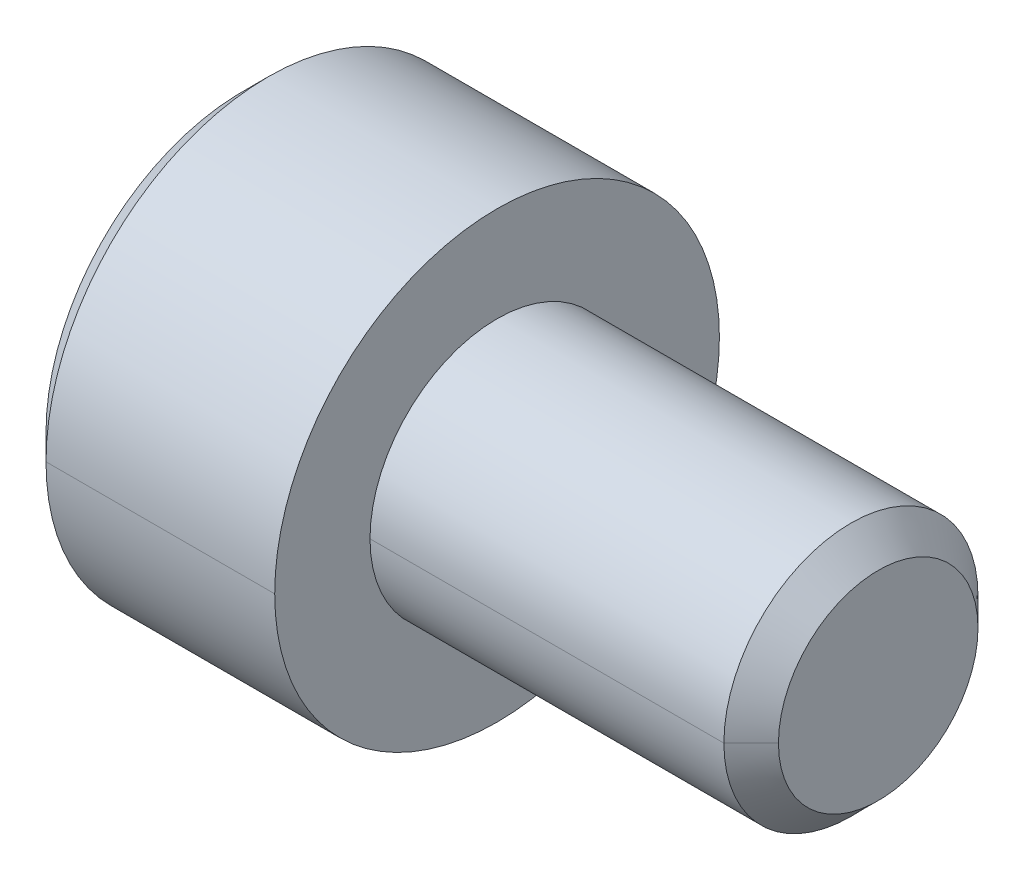
ISO-10303-21;
HEADER;
FILE_DESCRIPTION(('STEP AP214'),'2;1');
FILE_NAME('part.step','',(''),(''),'','','');
FILE_SCHEMA(('AUTOMOTIVE_DESIGN { 1 0 10303 214 1 1 1 1 }'));
ENDSEC;
DATA;
#1=APPLICATION_CONTEXT('core data for automotive mechanical design processes');
#2=APPLICATION_PROTOCOL_DEFINITION('international standard','automotive_design',2000,#1);
#3=PRODUCT_CONTEXT('',#1,'mechanical');
#4=PRODUCT('Part','Part','',(#3));
#5=PRODUCT_RELATED_PRODUCT_CATEGORY('part','',(#4));
#6=PRODUCT_DEFINITION_FORMATION('','',#4);
#7=PRODUCT_DEFINITION_CONTEXT('part definition',#1,'design');
#8=PRODUCT_DEFINITION('design','',#6,#7);
#9=PRODUCT_DEFINITION_SHAPE('','',#8);
#10=(LENGTH_UNIT() NAMED_UNIT(*) SI_UNIT(.MILLI.,.METRE.));
#11=(NAMED_UNIT(*) PLANE_ANGLE_UNIT() SI_UNIT($,.RADIAN.));
#12=(NAMED_UNIT(*) SI_UNIT($,.STERADIAN.) SOLID_ANGLE_UNIT());
#13=UNCERTAINTY_MEASURE_WITH_UNIT(LENGTH_MEASURE(1.E-05),#10,'distance_accuracy_value','');
#14=(GEOMETRIC_REPRESENTATION_CONTEXT(3) GLOBAL_UNCERTAINTY_ASSIGNED_CONTEXT((#13)) GLOBAL_UNIT_ASSIGNED_CONTEXT((#10,
#11,#12)) REPRESENTATION_CONTEXT('',''));
#15=CARTESIAN_POINT('',(0.,0.,0.));
#16=DIRECTION('',(0.,0.,1.));
#17=DIRECTION('',(1.,0.,0.));
#18=AXIS2_PLACEMENT_3D('',#15,#16,#17);
#19=CARTESIAN_POINT('',(-4.,0.,0.));
#20=DIRECTION('',(1.,0.,0.));
#21=DIRECTION('',(0.,-1.,0.));
#22=AXIS2_PLACEMENT_3D('',#19,#20,#21);
#23=CONICAL_SURFACE('',#22,3.1,0.7853981634);
#24=CARTESIAN_POINT('',(-3.6,0.,0.));
#25=DIRECTION('',(1.,0.,0.));
#26=DIRECTION('',(0.,0.,-1.));
#27=AXIS2_PLACEMENT_3D('',#24,#25,#26);
#28=CIRCLE('',#27,3.5);
#29=CARTESIAN_POINT('',(-3.6,0.,-3.5));
#30=VERTEX_POINT('',#29);
#31=CARTESIAN_POINT('',(-3.60000000000102,0.,3.50000000000102));
#32=VERTEX_POINT('',#31);
#33=EDGE_CURVE('E10',#30,#32,#28,.T.);
#34=ORIENTED_EDGE('',*,*,#33,.F.);
#35=CARTESIAN_POINT('',(-4.,0.,-3.1));
#36=DIRECTION('',(0.707106781184743,0.,-0.707106781188352));
#37=VECTOR('',#36,1.);
#38=LINE('',#35,#37);
#39=CARTESIAN_POINT('',(-4.,0.,-3.1));
#40=VERTEX_POINT('',#39);
#41=EDGE_CURVE('E25',#40,#30,#38,.T.);
#42=ORIENTED_EDGE('',*,*,#41,.F.);
#43=CARTESIAN_POINT('',(-4.,0.,0.));
#44=DIRECTION('',(1.,0.,0.));
#45=DIRECTION('',(0.,0.,-1.));
#46=AXIS2_PLACEMENT_3D('',#43,#44,#45);
#47=CIRCLE('',#46,3.1);
#48=CARTESIAN_POINT('',(-4.,0.,3.1));
#49=VERTEX_POINT('',#48);
#50=EDGE_CURVE('E556',#40,#49,#47,.T.);
#51=ORIENTED_EDGE('',*,*,#50,.T.);
#52=CARTESIAN_POINT('',(-4.,0.,3.1));
#53=DIRECTION('',(0.707106781184743,0.,0.707106781188352));
#54=VECTOR('',#53,1.);
#55=LINE('',#52,#54);
#56=EDGE_CURVE('E543',#49,#32,#55,.T.);
#57=ORIENTED_EDGE('',*,*,#56,.T.);
#58=EDGE_LOOP('',(#34,#42,#51,#57));
#59=FACE_BOUND('',#58,.T.);
#60=ADVANCED_FACE('F16',(#59),#23,.T.);
#61=CARTESIAN_POINT('',(-4.,0.,0.));
#62=DIRECTION('',(1.,0.,0.));
#63=DIRECTION('',(0.,1.,0.));
#64=AXIS2_PLACEMENT_3D('',#61,#62,#63);
#65=CONICAL_SURFACE('',#64,3.1,0.7853981634);
#66=CARTESIAN_POINT('',(-4.,0.,0.));
#67=DIRECTION('',(1.,0.,0.));
#68=DIRECTION('',(0.,0.,-1.));
#69=AXIS2_PLACEMENT_3D('',#66,#67,#68);
#70=CIRCLE('',#69,3.1);
#71=EDGE_CURVE('E541',#49,#40,#70,.T.);
#72=ORIENTED_EDGE('',*,*,#71,.T.);
#73=ORIENTED_EDGE('',*,*,#41,.T.);
#74=CARTESIAN_POINT('',(-3.6,0.,0.));
#75=DIRECTION('',(1.,0.,0.));
#76=DIRECTION('',(0.,0.,-1.));
#77=AXIS2_PLACEMENT_3D('',#74,#75,#76);
#78=CIRCLE('',#77,3.5);
#79=EDGE_CURVE('E544',#32,#30,#78,.T.);
#80=ORIENTED_EDGE('',*,*,#79,.F.);
#81=ORIENTED_EDGE('',*,*,#56,.F.);
#82=EDGE_LOOP('',(#72,#73,#80,#81));
#83=FACE_BOUND('',#82,.T.);
#84=ADVANCED_FACE('F518',(#83),#65,.T.);
#85=CARTESIAN_POINT('',(6.,0.,0.));
#86=DIRECTION('',(-1.,0.,0.));
#87=DIRECTION('',(0.,1.,0.));
#88=AXIS2_PLACEMENT_3D('',#85,#86,#87);
#89=CYLINDRICAL_SURFACE('',#88,3.5);
#90=ORIENTED_EDGE('',*,*,#79,.T.);
#91=CARTESIAN_POINT('',(0.,0.,-3.5));
#92=DIRECTION('',(-1.,0.,0.));
#93=VECTOR('',#92,1.);
#94=LINE('',#91,#93);
#95=CARTESIAN_POINT('',(0.,0.,-3.5));
#96=VERTEX_POINT('',#95);
#97=EDGE_CURVE('E481',#96,#30,#94,.T.);
#98=ORIENTED_EDGE('',*,*,#97,.F.);
#99=CARTESIAN_POINT('',(0.,0.,0.));
#100=DIRECTION('',(1.,0.,0.));
#101=DIRECTION('',(0.,0.,-1.));
#102=AXIS2_PLACEMENT_3D('',#99,#100,#101);
#103=CIRCLE('',#102,3.5);
#104=CARTESIAN_POINT('',(0.,0.,3.5));
#105=VERTEX_POINT('',#104);
#106=EDGE_CURVE('E499',#105,#96,#103,.T.);
#107=ORIENTED_EDGE('',*,*,#106,.F.);
#108=CARTESIAN_POINT('',(0.,0.,3.5));
#109=DIRECTION('',(-1.,0.,0.));
#110=VECTOR('',#109,1.);
#111=LINE('',#108,#110);
#112=EDGE_CURVE('E484',#105,#32,#111,.T.);
#113=ORIENTED_EDGE('',*,*,#112,.T.);
#114=EDGE_LOOP('',(#90,#98,#107,#113));
#115=FACE_BOUND('',#114,.T.);
#116=ADVANCED_FACE('F466',(#115),#89,.T.);
#117=CARTESIAN_POINT('',(6.,0.,0.));
#118=DIRECTION('',(-1.,0.,0.));
#119=DIRECTION('',(0.,-1.,0.));
#120=AXIS2_PLACEMENT_3D('',#117,#118,#119);
#121=CYLINDRICAL_SURFACE('',#120,3.5);
#122=CARTESIAN_POINT('',(0.,0.,0.));
#123=DIRECTION('',(1.,0.,0.));
#124=DIRECTION('',(0.,0.,-1.));
#125=AXIS2_PLACEMENT_3D('',#122,#123,#124);
#126=CIRCLE('',#125,3.5);
#127=EDGE_CURVE('E447',#96,#105,#126,.T.);
#128=ORIENTED_EDGE('',*,*,#127,.F.);
#129=ORIENTED_EDGE('',*,*,#97,.T.);
#130=ORIENTED_EDGE('',*,*,#33,.T.);
#131=ORIENTED_EDGE('',*,*,#112,.F.);
#132=EDGE_LOOP('',(#128,#129,#130,#131));
#133=FACE_BOUND('',#132,.T.);
#134=ADVANCED_FACE('F456',(#133),#121,.T.);
#135=CARTESIAN_POINT('',(0.,3.5,0.));
#136=DIRECTION('',(-1.,0.,0.));
#137=DIRECTION('',(0.,0.,1.));
#138=AXIS2_PLACEMENT_3D('',#135,#136,#137);
#139=PLANE('',#138);
#140=CARTESIAN_POINT('',(0.,0.,0.));
#141=DIRECTION('',(1.,0.,0.));
#142=DIRECTION('',(0.,0.,-1.));
#143=AXIS2_PLACEMENT_3D('',#140,#141,#142);
#144=CIRCLE('',#143,2.);
#145=CARTESIAN_POINT('',(0.,0.,-2.));
#146=VERTEX_POINT('',#145);
#147=CARTESIAN_POINT('',(0.,0.,2.));
#148=VERTEX_POINT('',#147);
#149=EDGE_CURVE('E443',#146,#148,#144,.T.);
#150=ORIENTED_EDGE('',*,*,#149,.F.);
#151=CARTESIAN_POINT('',(0.,0.,0.));
#152=DIRECTION('',(1.,0.,0.));
#153=DIRECTION('',(0.,0.,-1.));
#154=AXIS2_PLACEMENT_3D('',#151,#152,#153);
#155=CIRCLE('',#154,2.);
#156=EDGE_CURVE('E441',#148,#146,#155,.T.);
#157=ORIENTED_EDGE('',*,*,#156,.F.);
#158=EDGE_LOOP('',(#150,#157));
#159=FACE_BOUND('',#158,.T.);
#160=ORIENTED_EDGE('',*,*,#127,.T.);
#161=ORIENTED_EDGE('',*,*,#106,.T.);
#162=EDGE_LOOP('',(#160,#161));
#163=FACE_BOUND('',#162,.T.);
#164=ADVANCED_FACE('F465',(#159,#163),#139,.F.);
#165=CARTESIAN_POINT('',(6.,0.,0.));
#166=DIRECTION('',(-1.,0.,0.));
#167=DIRECTION('',(0.,1.,0.));
#168=AXIS2_PLACEMENT_3D('',#165,#166,#167);
#169=CYLINDRICAL_SURFACE('',#168,2.);
#170=ORIENTED_EDGE('',*,*,#156,.T.);
#171=CARTESIAN_POINT('',(5.5705,0.,-2.));
#172=DIRECTION('',(-1.,0.,0.));
#173=VECTOR('',#172,1.);
#174=LINE('',#171,#173);
#175=CARTESIAN_POINT('',(5.5705,0.,-2.));
#176=VERTEX_POINT('',#175);
#177=EDGE_CURVE('E411',#176,#146,#174,.T.);
#178=ORIENTED_EDGE('',*,*,#177,.F.);
#179=CARTESIAN_POINT('',(5.5705,0.,0.));
#180=DIRECTION('',(1.,0.,0.));
#181=DIRECTION('',(0.,0.,-1.));
#182=AXIS2_PLACEMENT_3D('',#179,#180,#181);
#183=CIRCLE('',#182,2.);
#184=CARTESIAN_POINT('',(5.5705,0.,2.));
#185=VERTEX_POINT('',#184);
#186=EDGE_CURVE('E428',#185,#176,#183,.T.);
#187=ORIENTED_EDGE('',*,*,#186,.F.);
#188=CARTESIAN_POINT('',(5.5705,0.,2.));
#189=DIRECTION('',(-1.,0.,0.));
#190=VECTOR('',#189,1.);
#191=LINE('',#188,#190);
#192=EDGE_CURVE('E413',#185,#148,#191,.T.);
#193=ORIENTED_EDGE('',*,*,#192,.T.);
#194=EDGE_LOOP('',(#170,#178,#187,#193));
#195=FACE_BOUND('',#194,.T.);
#196=ADVANCED_FACE('F394',(#195),#169,.T.);
#197=CARTESIAN_POINT('',(6.,0.,0.));
#198=DIRECTION('',(-1.,0.,0.));
#199=DIRECTION('',(0.,-1.,0.));
#200=AXIS2_PLACEMENT_3D('',#197,#198,#199);
#201=CYLINDRICAL_SURFACE('',#200,2.);
#202=CARTESIAN_POINT('',(5.5705,0.,0.));
#203=DIRECTION('',(1.,0.,0.));
#204=DIRECTION('',(0.,0.,-1.));
#205=AXIS2_PLACEMENT_3D('',#202,#203,#204);
#206=CIRCLE('',#205,2.);
#207=EDGE_CURVE('E377',#176,#185,#206,.T.);
#208=ORIENTED_EDGE('',*,*,#207,.F.);
#209=ORIENTED_EDGE('',*,*,#177,.T.);
#210=ORIENTED_EDGE('',*,*,#149,.T.);
#211=ORIENTED_EDGE('',*,*,#192,.F.);
#212=EDGE_LOOP('',(#208,#209,#210,#211));
#213=FACE_BOUND('',#212,.T.);
#214=ADVANCED_FACE('F385',(#213),#201,.T.);
#215=CARTESIAN_POINT('',(5.5705,0.,0.));
#216=DIRECTION('',(-1.,0.,0.));
#217=DIRECTION('',(0.,-1.,0.));
#218=AXIS2_PLACEMENT_3D('',#215,#216,#217);
#219=CONICAL_SURFACE('',#218,2.,0.7853981634);
#220=CARTESIAN_POINT('',(6.,0.,0.));
#221=DIRECTION('',(1.,0.,0.));
#222=DIRECTION('',(0.,0.,-1.));
#223=AXIS2_PLACEMENT_3D('',#220,#221,#222);
#224=CIRCLE('',#223,1.5705);
#225=CARTESIAN_POINT('',(6.,0.,-1.5705));
#226=VERTEX_POINT('',#225);
#227=CARTESIAN_POINT('',(5.9999999999989,0.,1.5704999999989));
#228=VERTEX_POINT('',#227);
#229=EDGE_CURVE('E374',#226,#228,#224,.T.);
#230=ORIENTED_EDGE('',*,*,#229,.F.);
#231=CARTESIAN_POINT('',(5.9999999999989,0.,-1.5704999999989));
#232=DIRECTION('',(-0.707106781184743,0.,-0.707106781188352));
#233=VECTOR('',#232,1.);
#234=LINE('',#231,#233);
#235=EDGE_CURVE('E351',#226,#176,#234,.T.);
#236=ORIENTED_EDGE('',*,*,#235,.T.);
#237=ORIENTED_EDGE('',*,*,#207,.T.);
#238=CARTESIAN_POINT('',(5.9999999999989,0.,1.5704999999989));
#239=DIRECTION('',(-0.707106781184743,0.,0.707106781188352));
#240=VECTOR('',#239,1.);
#241=LINE('',#238,#240);
#242=EDGE_CURVE('E364',#228,#185,#241,.T.);
#243=ORIENTED_EDGE('',*,*,#242,.F.);
#244=EDGE_LOOP('',(#230,#236,#237,#243));
#245=FACE_BOUND('',#244,.T.);
#246=ADVANCED_FACE('F329',(#245),#219,.T.);
#247=CARTESIAN_POINT('',(5.5705,0.,0.));
#248=DIRECTION('',(-1.,0.,0.));
#249=DIRECTION('',(0.,1.,0.));
#250=AXIS2_PLACEMENT_3D('',#247,#248,#249);
#251=CONICAL_SURFACE('',#250,2.,0.7853981634);
#252=ORIENTED_EDGE('',*,*,#186,.T.);
#253=ORIENTED_EDGE('',*,*,#235,.F.);
#254=CARTESIAN_POINT('',(6.,0.,0.));
#255=DIRECTION('',(1.,0.,0.));
#256=DIRECTION('',(0.,0.,-1.));
#257=AXIS2_PLACEMENT_3D('',#254,#255,#256);
#258=CIRCLE('',#257,1.5705);
#259=EDGE_CURVE('E309',#228,#226,#258,.T.);
#260=ORIENTED_EDGE('',*,*,#259,.F.);
#261=ORIENTED_EDGE('',*,*,#242,.T.);
#262=EDGE_LOOP('',(#252,#253,#260,#261));
#263=FACE_BOUND('',#262,.T.);
#264=ADVANCED_FACE('F318',(#263),#251,.T.);
#265=CARTESIAN_POINT('',(6.,1.5705,0.));
#266=DIRECTION('',(-1.,0.,0.));
#267=DIRECTION('',(0.,0.,1.));
#268=AXIS2_PLACEMENT_3D('',#265,#266,#267);
#269=PLANE('',#268);
#270=ORIENTED_EDGE('',*,*,#229,.T.);
#271=ORIENTED_EDGE('',*,*,#259,.T.);
#272=EDGE_LOOP('',(#270,#271));
#273=FACE_BOUND('',#272,.T.);
#274=ADVANCED_FACE('F328',(#273),#269,.F.);
#275=CARTESIAN_POINT('',(-4.,0.,0.));
#276=DIRECTION('',(1.,0.,0.));
#277=DIRECTION('',(0.,0.,-1.));
#278=AXIS2_PLACEMENT_3D('',#275,#276,#277);
#279=PLANE('',#278);
#280=ORIENTED_EDGE('',*,*,#50,.F.);
#281=ORIENTED_EDGE('',*,*,#71,.F.);
#282=EDGE_LOOP('',(#280,#281));
#283=FACE_BOUND('',#282,.T.);
#284=DIRECTION('',(0.,0.500000000000009,-0.866025403784433));
#285=VECTOR('',#284,1.);
#286=CARTESIAN_POINT('',(-4.,-1.7320508075689,0.));
#287=LINE('',#286,#285);
#288=CARTESIAN_POINT('',(-4.,-1.7320508075689,0.));
#289=VERTEX_POINT('',#288);
#290=CARTESIAN_POINT('',(-4.,-0.86602540378444,-1.5));
#291=VERTEX_POINT('',#290);
#292=EDGE_CURVE('E305',#289,#291,#287,.T.);
#293=ORIENTED_EDGE('',*,*,#292,.T.);
#294=DIRECTION('',(0.,1.,0.));
#295=VECTOR('',#294,1.);
#296=CARTESIAN_POINT('',(-4.,-0.86602540378444,-1.5));
#297=LINE('',#296,#295);
#298=CARTESIAN_POINT('',(-4.,0.86602540378444,-1.5));
#299=VERTEX_POINT('',#298);
#300=EDGE_CURVE('E301',#291,#299,#297,.T.);
#301=ORIENTED_EDGE('',*,*,#300,.T.);
#302=DIRECTION('',(0.,0.500000000000009,0.866025403784433));
#303=VECTOR('',#302,1.);
#304=CARTESIAN_POINT('',(-4.,0.86602540378444,-1.5));
#305=LINE('',#304,#303);
#306=CARTESIAN_POINT('',(-4.,1.7320508075689,0.));
#307=VERTEX_POINT('',#306);
#308=EDGE_CURVE('E297',#299,#307,#305,.T.);
#309=ORIENTED_EDGE('',*,*,#308,.T.);
#310=DIRECTION('',(0.,-0.500000000000009,0.866025403784433));
#311=VECTOR('',#310,1.);
#312=CARTESIAN_POINT('',(-4.,1.7320508075689,0.));
#313=LINE('',#312,#311);
#314=CARTESIAN_POINT('',(-4.,0.86602540378444,1.5));
#315=VERTEX_POINT('',#314);
#316=EDGE_CURVE('E293',#307,#315,#313,.T.);
#317=ORIENTED_EDGE('',*,*,#316,.T.);
#318=DIRECTION('',(0.,-1.,0.));
#319=VECTOR('',#318,1.);
#320=CARTESIAN_POINT('',(-4.,0.86602540378444,1.5));
#321=LINE('',#320,#319);
#322=CARTESIAN_POINT('',(-4.,-0.86602540378444,1.5));
#323=VERTEX_POINT('',#322);
#324=EDGE_CURVE('E289',#315,#323,#321,.T.);
#325=ORIENTED_EDGE('',*,*,#324,.T.);
#326=DIRECTION('',(0.,-0.500000000000009,-0.866025403784433));
#327=VECTOR('',#326,1.);
#328=CARTESIAN_POINT('',(-4.,-0.86602540378444,1.5));
#329=LINE('',#328,#327);
#330=EDGE_CURVE('E285',#323,#289,#329,.T.);
#331=ORIENTED_EDGE('',*,*,#330,.T.);
#332=EDGE_LOOP('',(#293,#301,#309,#317,#325,#331));
#333=FACE_BOUND('',#332,.T.);
#334=ADVANCED_FACE('F570',(#283,#333),#279,.F.);
#335=CARTESIAN_POINT('',(-2.,-0.86602540378444,1.5));
#336=DIRECTION('',(0.,0.866025403784433,-0.500000000000009));
#337=DIRECTION('',(0.,0.500000000000009,0.866025403784433));
#338=AXIS2_PLACEMENT_3D('',#335,#336,#337);
#339=PLANE('',#338);
#340=ORIENTED_EDGE('',*,*,#330,.F.);
#341=DIRECTION('',(-1.,0.,0.));
#342=VECTOR('',#341,1.);
#343=CARTESIAN_POINT('',(-2.,-0.86602540378444,1.5));
#344=LINE('',#343,#342);
#345=CARTESIAN_POINT('',(-2.,-0.86602540378444,1.5));
#346=VERTEX_POINT('',#345);
#347=EDGE_CURVE('E280',#346,#323,#344,.T.);
#348=ORIENTED_EDGE('',*,*,#347,.F.);
#349=DIRECTION('',(0.,-0.500000000000009,-0.866025403784433));
#350=VECTOR('',#349,1.);
#351=CARTESIAN_POINT('',(-2.,-0.86602540378444,1.5));
#352=LINE('',#351,#350);
#353=CARTESIAN_POINT('',(-2.,-1.29903810567666,0.750000000000019));
#354=VERTEX_POINT('',#353);
#355=EDGE_CURVE('E276',#346,#354,#352,.T.);
#356=ORIENTED_EDGE('',*,*,#355,.T.);
#357=DIRECTION('',(0.,-0.500000000000009,-0.866025403784433));
#358=VECTOR('',#357,1.);
#359=CARTESIAN_POINT('',(-2.,-0.86602540378444,1.5));
#360=LINE('',#359,#358);
#361=CARTESIAN_POINT('',(-2.,-1.7320508075689,0.));
#362=VERTEX_POINT('',#361);
#363=EDGE_CURVE('E272',#354,#362,#360,.T.);
#364=ORIENTED_EDGE('',*,*,#363,.T.);
#365=DIRECTION('',(-1.,0.,0.));
#366=VECTOR('',#365,1.);
#367=CARTESIAN_POINT('',(-2.,-1.7320508075689,0.));
#368=LINE('',#367,#366);
#369=EDGE_CURVE('E267',#362,#289,#368,.T.);
#370=ORIENTED_EDGE('',*,*,#369,.T.);
#371=EDGE_LOOP('',(#340,#348,#356,#364,#370));
#372=FACE_BOUND('',#371,.T.);
#373=ADVANCED_FACE('F573',(#372),#339,.T.);
#374=CARTESIAN_POINT('',(-2.,-1.7320508075689,0.));
#375=DIRECTION('',(0.,0.866025403784433,0.500000000000009));
#376=DIRECTION('',(0.,-0.500000000000009,0.866025403784433));
#377=AXIS2_PLACEMENT_3D('',#374,#375,#376);
#378=PLANE('',#377);
#379=ORIENTED_EDGE('',*,*,#292,.F.);
#380=ORIENTED_EDGE('',*,*,#369,.F.);
#381=DIRECTION('',(0.,0.500000000000009,-0.866025403784433));
#382=VECTOR('',#381,1.);
#383=CARTESIAN_POINT('',(-2.,-1.7320508075689,0.));
#384=LINE('',#383,#382);
#385=CARTESIAN_POINT('',(-2.,-1.29903810567665,-0.750000000000014));
#386=VERTEX_POINT('',#385);
#387=EDGE_CURVE('E263',#362,#386,#384,.T.);
#388=ORIENTED_EDGE('',*,*,#387,.T.);
#389=DIRECTION('',(0.,0.500000000000009,-0.866025403784433));
#390=VECTOR('',#389,1.);
#391=CARTESIAN_POINT('',(-2.,-1.7320508075689,0.));
#392=LINE('',#391,#390);
#393=CARTESIAN_POINT('',(-2.,-0.86602540378444,-1.5));
#394=VERTEX_POINT('',#393);
#395=EDGE_CURVE('E259',#386,#394,#392,.T.);
#396=ORIENTED_EDGE('',*,*,#395,.T.);
#397=DIRECTION('',(-1.,0.,0.));
#398=VECTOR('',#397,1.);
#399=CARTESIAN_POINT('',(-2.,-0.86602540378444,-1.5));
#400=LINE('',#399,#398);
#401=EDGE_CURVE('E254',#394,#291,#400,.T.);
#402=ORIENTED_EDGE('',*,*,#401,.T.);
#403=EDGE_LOOP('',(#379,#380,#388,#396,#402));
#404=FACE_BOUND('',#403,.T.);
#405=ADVANCED_FACE('F580',(#404),#378,.T.);
#406=CARTESIAN_POINT('',(-2.,-0.86602540378444,-1.5));
#407=DIRECTION('',(0.,0.,1.));
#408=DIRECTION('',(1.,0.,0.));
#409=AXIS2_PLACEMENT_3D('',#406,#407,#408);
#410=PLANE('',#409);
#411=ORIENTED_EDGE('',*,*,#300,.F.);
#412=ORIENTED_EDGE('',*,*,#401,.F.);
#413=DIRECTION('',(0.,1.,0.));
#414=VECTOR('',#413,1.);
#415=CARTESIAN_POINT('',(-2.,-0.86602540378444,-1.5));
#416=LINE('',#415,#414);
#417=CARTESIAN_POINT('',(-2.,0.,-1.5));
#418=VERTEX_POINT('',#417);
#419=EDGE_CURVE('E250',#394,#418,#416,.T.);
#420=ORIENTED_EDGE('',*,*,#419,.T.);
#421=DIRECTION('',(0.,1.,0.));
#422=VECTOR('',#421,1.);
#423=CARTESIAN_POINT('',(-2.,-0.86602540378444,-1.5));
#424=LINE('',#423,#422);
#425=CARTESIAN_POINT('',(-2.,0.86602540378444,-1.5));
#426=VERTEX_POINT('',#425);
#427=EDGE_CURVE('E246',#418,#426,#424,.T.);
#428=ORIENTED_EDGE('',*,*,#427,.T.);
#429=DIRECTION('',(-1.,0.,0.));
#430=VECTOR('',#429,1.);
#431=CARTESIAN_POINT('',(-2.,0.86602540378444,-1.5));
#432=LINE('',#431,#430);
#433=EDGE_CURVE('E241',#426,#299,#432,.T.);
#434=ORIENTED_EDGE('',*,*,#433,.T.);
#435=EDGE_LOOP('',(#411,#412,#420,#428,#434));
#436=FACE_BOUND('',#435,.T.);
#437=ADVANCED_FACE('F584',(#436),#410,.T.);
#438=CARTESIAN_POINT('',(-2.,0.86602540378444,-1.5));
#439=DIRECTION('',(0.,-0.866025403784433,0.500000000000009));
#440=DIRECTION('',(0.,-0.500000000000009,-0.866025403784433));
#441=AXIS2_PLACEMENT_3D('',#438,#439,#440);
#442=PLANE('',#441);
#443=ORIENTED_EDGE('',*,*,#308,.F.);
#444=ORIENTED_EDGE('',*,*,#433,.F.);
#445=DIRECTION('',(0.,0.500000000000009,0.866025403784433));
#446=VECTOR('',#445,1.);
#447=CARTESIAN_POINT('',(-2.,0.86602540378444,-1.5));
#448=LINE('',#447,#446);
#449=CARTESIAN_POINT('',(-2.,1.29903810567666,-0.750000000000019));
#450=VERTEX_POINT('',#449);
#451=EDGE_CURVE('E237',#426,#450,#448,.T.);
#452=ORIENTED_EDGE('',*,*,#451,.T.);
#453=DIRECTION('',(0.,0.500000000000009,0.866025403784433));
#454=VECTOR('',#453,1.);
#455=CARTESIAN_POINT('',(-2.,0.86602540378444,-1.5));
#456=LINE('',#455,#454);
#457=CARTESIAN_POINT('',(-2.,1.7320508075689,0.));
#458=VERTEX_POINT('',#457);
#459=EDGE_CURVE('E233',#450,#458,#456,.T.);
#460=ORIENTED_EDGE('',*,*,#459,.T.);
#461=DIRECTION('',(-1.,0.,0.));
#462=VECTOR('',#461,1.);
#463=CARTESIAN_POINT('',(-2.,1.7320508075689,0.));
#464=LINE('',#463,#462);
#465=EDGE_CURVE('E228',#458,#307,#464,.T.);
#466=ORIENTED_EDGE('',*,*,#465,.T.);
#467=EDGE_LOOP('',(#443,#444,#452,#460,#466));
#468=FACE_BOUND('',#467,.T.);
#469=ADVANCED_FACE('F589',(#468),#442,.T.);
#470=CARTESIAN_POINT('',(-2.,1.7320508075689,0.));
#471=DIRECTION('',(0.,-0.866025403784433,-0.500000000000009));
#472=DIRECTION('',(0.,0.500000000000009,-0.866025403784433));
#473=AXIS2_PLACEMENT_3D('',#470,#471,#472);
#474=PLANE('',#473);
#475=ORIENTED_EDGE('',*,*,#316,.F.);
#476=ORIENTED_EDGE('',*,*,#465,.F.);
#477=DIRECTION('',(0.,-0.500000000000009,0.866025403784433));
#478=VECTOR('',#477,1.);
#479=CARTESIAN_POINT('',(-2.,1.7320508075689,0.));
#480=LINE('',#479,#478);
#481=CARTESIAN_POINT('',(-2.,1.29903810567666,0.750000000000019));
#482=VERTEX_POINT('',#481);
#483=EDGE_CURVE('E224',#458,#482,#480,.T.);
#484=ORIENTED_EDGE('',*,*,#483,.T.);
#485=DIRECTION('',(0.,-0.500000000000009,0.866025403784433));
#486=VECTOR('',#485,1.);
#487=CARTESIAN_POINT('',(-2.,1.7320508075689,0.));
#488=LINE('',#487,#486);
#489=CARTESIAN_POINT('',(-2.,0.86602540378444,1.5));
#490=VERTEX_POINT('',#489);
#491=EDGE_CURVE('E220',#482,#490,#488,.T.);
#492=ORIENTED_EDGE('',*,*,#491,.T.);
#493=DIRECTION('',(-1.,0.,0.));
#494=VECTOR('',#493,1.);
#495=CARTESIAN_POINT('',(-2.,0.86602540378444,1.5));
#496=LINE('',#495,#494);
#497=EDGE_CURVE('E215',#490,#315,#496,.T.);
#498=ORIENTED_EDGE('',*,*,#497,.T.);
#499=EDGE_LOOP('',(#475,#476,#484,#492,#498));
#500=FACE_BOUND('',#499,.T.);
#501=ADVANCED_FACE('F595',(#500),#474,.T.);
#502=CARTESIAN_POINT('',(-2.,0.86602540378444,1.5));
#503=DIRECTION('',(0.,0.,-1.));
#504=DIRECTION('',(-1.,0.,0.));
#505=AXIS2_PLACEMENT_3D('',#502,#503,#504);
#506=PLANE('',#505);
#507=ORIENTED_EDGE('',*,*,#324,.F.);
#508=ORIENTED_EDGE('',*,*,#497,.F.);
#509=DIRECTION('',(0.,-1.,0.));
#510=VECTOR('',#509,1.);
#511=CARTESIAN_POINT('',(-2.,0.86602540378444,1.5));
#512=LINE('',#511,#510);
#513=CARTESIAN_POINT('',(-2.,0.,1.5));
#514=VERTEX_POINT('',#513);
#515=EDGE_CURVE('E211',#490,#514,#512,.T.);
#516=ORIENTED_EDGE('',*,*,#515,.T.);
#517=DIRECTION('',(0.,-1.,0.));
#518=VECTOR('',#517,1.);
#519=CARTESIAN_POINT('',(-2.,0.86602540378444,1.5));
#520=LINE('',#519,#518);
#521=EDGE_CURVE('E206',#514,#346,#520,.T.);
#522=ORIENTED_EDGE('',*,*,#521,.T.);
#523=ORIENTED_EDGE('',*,*,#347,.T.);
#524=EDGE_LOOP('',(#507,#508,#516,#522,#523));
#525=FACE_BOUND('',#524,.T.);
#526=ADVANCED_FACE('F599',(#525),#506,.T.);
#527=CARTESIAN_POINT('',(-2.,0.,0.));
#528=DIRECTION('',(1.,0.,0.));
#529=DIRECTION('',(0.,0.,-1.));
#530=AXIS2_PLACEMENT_3D('',#527,#528,#529);
#531=PLANE('',#530);
#532=CARTESIAN_POINT('',(-2.,0.,0.));
#533=DIRECTION('',(1.,0.,0.));
#534=DIRECTION('',(0.,0.,-1.));
#535=AXIS2_PLACEMENT_3D('',#532,#533,#534);
#536=CIRCLE('',#535,1.5);
#537=EDGE_CURVE('E134',#514,#354,#536,.T.);
#538=ORIENTED_EDGE('',*,*,#537,.T.);
#539=ORIENTED_EDGE('',*,*,#355,.F.);
#540=ORIENTED_EDGE('',*,*,#521,.F.);
#541=EDGE_LOOP('',(#538,#539,#540));
#542=FACE_BOUND('',#541,.T.);
#543=ADVANCED_FACE('F183',(#542),#531,.F.);
#544=CARTESIAN_POINT('',(-2.,0.,0.));
#545=DIRECTION('',(-1.,0.,0.));
#546=DIRECTION('',(0.,1.,0.));
#547=AXIS2_PLACEMENT_3D('',#544,#545,#546);
#548=CONICAL_SURFACE('',#547,1.5,1.0471975512);
#549=CARTESIAN_POINT('',(-1.13397459622237,0.,0.));
#550=DIRECTION('',(-0.499999999997053,0.,-0.86602540378614));
#551=VECTOR('',#550,1.);
#552=LINE('',#549,#551);
#553=CARTESIAN_POINT('',(-1.1339745962156,0.,0.));
#554=VERTEX_POINT('',#553);
#555=EDGE_CURVE('E129',#554,#418,#552,.T.);
#556=ORIENTED_EDGE('',*,*,#555,.T.);
#557=CARTESIAN_POINT('',(-2.,0.,0.));
#558=DIRECTION('',(1.,0.,0.));
#559=DIRECTION('',(0.,0.,-1.));
#560=AXIS2_PLACEMENT_3D('',#557,#558,#559);
#561=CIRCLE('',#560,1.5);
#562=EDGE_CURVE('E149',#386,#418,#561,.T.);
#563=ORIENTED_EDGE('',*,*,#562,.F.);
#564=CARTESIAN_POINT('',(-2.,0.,0.));
#565=DIRECTION('',(1.,0.,0.));
#566=DIRECTION('',(0.,0.,-1.));
#567=AXIS2_PLACEMENT_3D('',#564,#565,#566);
#568=CIRCLE('',#567,1.5);
#569=EDGE_CURVE('E139',#354,#386,#568,.T.);
#570=ORIENTED_EDGE('',*,*,#569,.F.);
#571=ORIENTED_EDGE('',*,*,#537,.F.);
#572=CARTESIAN_POINT('',(-1.13397459622237,0.,0.));
#573=DIRECTION('',(-0.499999999997053,0.,0.86602540378614));
#574=VECTOR('',#573,1.);
#575=LINE('',#572,#574);
#576=EDGE_CURVE('E124',#554,#514,#575,.T.);
#577=ORIENTED_EDGE('',*,*,#576,.F.);
#578=EDGE_LOOP('',(#556,#563,#570,#571,#577));
#579=FACE_BOUND('',#578,.T.);
#580=ADVANCED_FACE('F127',(#579),#548,.F.);
#581=CARTESIAN_POINT('',(-2.,0.,0.));
#582=DIRECTION('',(-1.,0.,0.));
#583=DIRECTION('',(0.,-1.,0.));
#584=AXIS2_PLACEMENT_3D('',#581,#582,#583);
#585=CONICAL_SURFACE('',#584,1.5,1.0471975512);
#586=ORIENTED_EDGE('',*,*,#576,.T.);
#587=CARTESIAN_POINT('',(-2.,0.,0.));
#588=DIRECTION('',(1.,0.,0.));
#589=DIRECTION('',(0.,0.,-1.));
#590=AXIS2_PLACEMENT_3D('',#587,#588,#589);
#591=CIRCLE('',#590,1.5);
#592=EDGE_CURVE('E140',#482,#514,#591,.T.);
#593=ORIENTED_EDGE('',*,*,#592,.F.);
#594=CARTESIAN_POINT('',(-2.,0.,0.));
#595=DIRECTION('',(1.,0.,0.));
#596=DIRECTION('',(0.,0.,-1.));
#597=AXIS2_PLACEMENT_3D('',#594,#595,#596);
#598=CIRCLE('',#597,1.5);
#599=EDGE_CURVE('E156',#450,#482,#598,.T.);
#600=ORIENTED_EDGE('',*,*,#599,.F.);
#601=CARTESIAN_POINT('',(-2.,0.,0.));
#602=DIRECTION('',(1.,0.,0.));
#603=DIRECTION('',(0.,0.,-1.));
#604=AXIS2_PLACEMENT_3D('',#601,#602,#603);
#605=CIRCLE('',#604,1.5);
#606=EDGE_CURVE('E147',#418,#450,#605,.T.);
#607=ORIENTED_EDGE('',*,*,#606,.F.);
#608=ORIENTED_EDGE('',*,*,#555,.F.);
#609=EDGE_LOOP('',(#586,#593,#600,#607,#608));
#610=FACE_BOUND('',#609,.T.);
#611=ADVANCED_FACE('F144',(#610),#585,.F.);
#612=CARTESIAN_POINT('',(-2.,0.,0.));
#613=DIRECTION('',(1.,0.,0.));
#614=DIRECTION('',(0.,0.,-1.));
#615=AXIS2_PLACEMENT_3D('',#612,#613,#614);
#616=PLANE('',#615);
#617=ORIENTED_EDGE('',*,*,#606,.T.);
#618=ORIENTED_EDGE('',*,*,#451,.F.);
#619=ORIENTED_EDGE('',*,*,#427,.F.);
#620=EDGE_LOOP('',(#617,#618,#619));
#621=FACE_BOUND('',#620,.T.);
#622=ADVANCED_FACE('F177',(#621),#616,.F.);
#623=CARTESIAN_POINT('',(-2.,0.,0.));
#624=DIRECTION('',(1.,0.,0.));
#625=DIRECTION('',(0.,0.,-1.));
#626=AXIS2_PLACEMENT_3D('',#623,#624,#625);
#627=PLANE('',#626);
#628=ORIENTED_EDGE('',*,*,#459,.F.);
#629=ORIENTED_EDGE('',*,*,#599,.T.);
#630=ORIENTED_EDGE('',*,*,#483,.F.);
#631=EDGE_LOOP('',(#628,#629,#630));
#632=FACE_BOUND('',#631,.T.);
#633=ADVANCED_FACE('F728',(#632),#627,.F.);
#634=CARTESIAN_POINT('',(-2.,0.,0.));
#635=DIRECTION('',(1.,0.,0.));
#636=DIRECTION('',(0.,0.,-1.));
#637=AXIS2_PLACEMENT_3D('',#634,#635,#636);
#638=PLANE('',#637);
#639=ORIENTED_EDGE('',*,*,#592,.T.);
#640=ORIENTED_EDGE('',*,*,#515,.F.);
#641=ORIENTED_EDGE('',*,*,#491,.F.);
#642=EDGE_LOOP('',(#639,#640,#641));
#643=FACE_BOUND('',#642,.T.);
#644=ADVANCED_FACE('F619',(#643),#638,.F.);
#645=CARTESIAN_POINT('',(-2.,0.,0.));
#646=DIRECTION('',(1.,0.,0.));
#647=DIRECTION('',(0.,0.,-1.));
#648=AXIS2_PLACEMENT_3D('',#645,#646,#647);
#649=PLANE('',#648);
#650=ORIENTED_EDGE('',*,*,#569,.T.);
#651=ORIENTED_EDGE('',*,*,#387,.F.);
#652=ORIENTED_EDGE('',*,*,#363,.F.);
#653=EDGE_LOOP('',(#650,#651,#652));
#654=FACE_BOUND('',#653,.T.);
#655=ADVANCED_FACE('F607',(#654),#649,.F.);
#656=CARTESIAN_POINT('',(-2.,0.,0.));
#657=DIRECTION('',(1.,0.,0.));
#658=DIRECTION('',(0.,0.,-1.));
#659=AXIS2_PLACEMENT_3D('',#656,#657,#658);
#660=PLANE('',#659);
#661=ORIENTED_EDGE('',*,*,#562,.T.);
#662=ORIENTED_EDGE('',*,*,#419,.F.);
#663=ORIENTED_EDGE('',*,*,#395,.F.);
#664=EDGE_LOOP('',(#661,#662,#663));
#665=FACE_BOUND('',#664,.T.);
#666=ADVANCED_FACE('F610',(#665),#660,.F.);
#667=CLOSED_SHELL('',(#60,#84,#116,#134,#164,#196,#214,#246,#264,#274,#334,#373,#405,#437,#469,
#501,#526,#543,#580,#611,#622,#633,#644,#655,#666));
#668=MANIFOLD_SOLID_BREP('B1',#667);
#669=ADVANCED_BREP_SHAPE_REPRESENTATION('',(#18,#668),#14);
#670=SHAPE_DEFINITION_REPRESENTATION(#9,#669);
ENDSEC;
END-ISO-10303-21;
